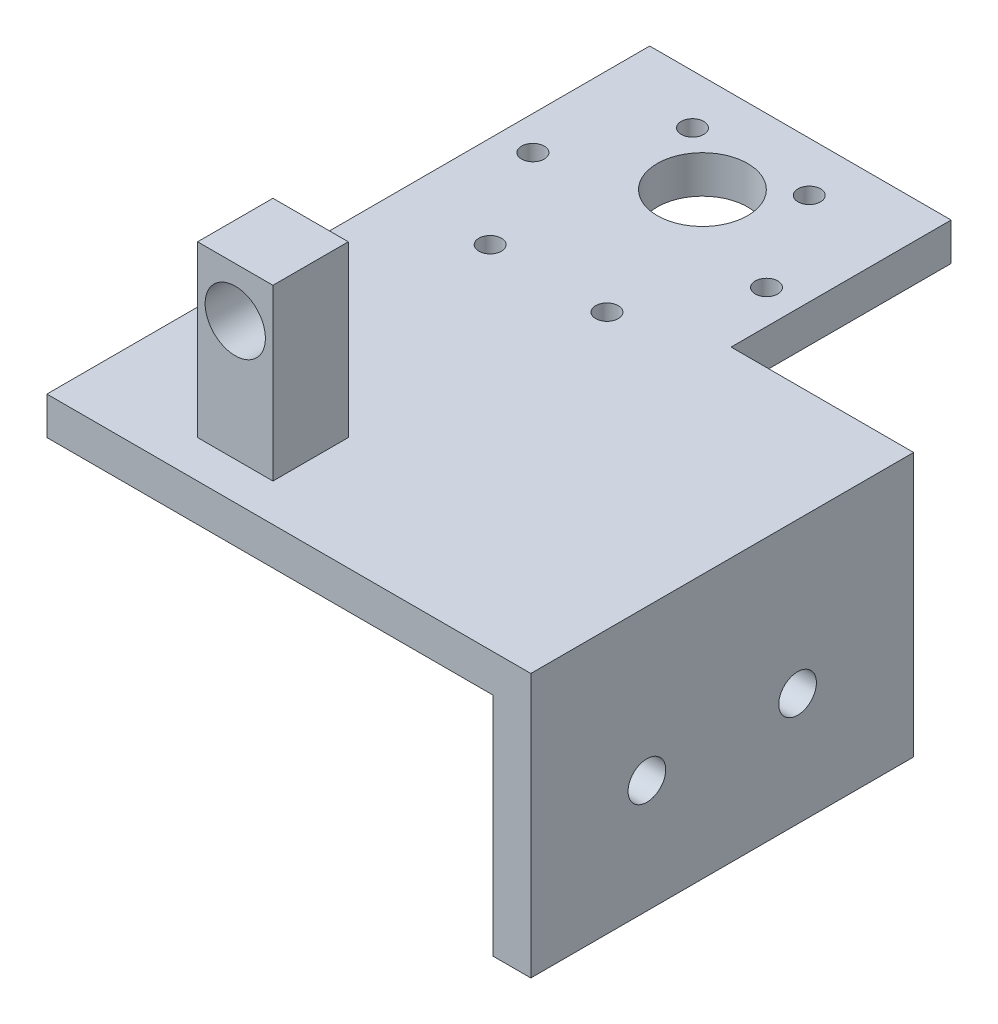
ISO-10303-21;
HEADER;
FILE_DESCRIPTION(('STEP AP214'),'2;1');
FILE_NAME('part.step','',(''),(''),'','','');
FILE_SCHEMA(('AUTOMOTIVE_DESIGN { 1 0 10303 214 1 1 1 1 }'));
ENDSEC;
DATA;
#1=APPLICATION_CONTEXT('core data for automotive mechanical design processes');
#2=APPLICATION_PROTOCOL_DEFINITION('international standard','automotive_design',2000,#1);
#3=PRODUCT_CONTEXT('',#1,'mechanical');
#4=PRODUCT('Part','Part','',(#3));
#5=PRODUCT_RELATED_PRODUCT_CATEGORY('part','',(#4));
#6=PRODUCT_DEFINITION_FORMATION('','',#4);
#7=PRODUCT_DEFINITION_CONTEXT('part definition',#1,'design');
#8=PRODUCT_DEFINITION('design','',#6,#7);
#9=PRODUCT_DEFINITION_SHAPE('','',#8);
#10=(LENGTH_UNIT() NAMED_UNIT(*) SI_UNIT(.MILLI.,.METRE.));
#11=(NAMED_UNIT(*) PLANE_ANGLE_UNIT() SI_UNIT($,.RADIAN.));
#12=(NAMED_UNIT(*) SI_UNIT($,.STERADIAN.) SOLID_ANGLE_UNIT());
#13=UNCERTAINTY_MEASURE_WITH_UNIT(LENGTH_MEASURE(1.E-05),#10,'distance_accuracy_value','');
#14=(GEOMETRIC_REPRESENTATION_CONTEXT(3) GLOBAL_UNCERTAINTY_ASSIGNED_CONTEXT((#13)) GLOBAL_UNIT_ASSIGNED_CONTEXT((#10,
#11,#12)) REPRESENTATION_CONTEXT('',''));
#15=CARTESIAN_POINT('',(0.,0.,0.));
#16=DIRECTION('',(0.,0.,1.));
#17=DIRECTION('',(1.,0.,0.));
#18=AXIS2_PLACEMENT_3D('',#15,#16,#17);
#19=CARTESIAN_POINT('',(0.,0.,0.));
#20=DIRECTION('',(0.,1.,0.));
#21=DIRECTION('',(0.,0.,1.));
#22=AXIS2_PLACEMENT_3D('',#19,#20,#21);
#23=PLANE('',#22);
#24=CARTESIAN_POINT('',(-15.5,0.,0.));
#25=DIRECTION('',(0.,1.,0.));
#26=DIRECTION('',(0.,0.,1.));
#27=AXIS2_PLACEMENT_3D('',#24,#25,#26);
#28=CIRCLE('',#27,1.5);
#29=CARTESIAN_POINT('',(-15.5,0.,1.5));
#30=VERTEX_POINT('',#29);
#31=EDGE_CURVE('E235',#30,#30,#28,.T.);
#32=ORIENTED_EDGE('',*,*,#31,.T.);
#33=EDGE_LOOP('',(#32));
#34=FACE_BOUND('',#33,.T.);
#35=CARTESIAN_POINT('',(7.75000000000006,0.,-13.4233937586588));
#36=DIRECTION('',(0.,1.,0.));
#37=DIRECTION('',(0.,0.,1.));
#38=AXIS2_PLACEMENT_3D('',#35,#36,#37);
#39=CIRCLE('',#38,1.5);
#40=CARTESIAN_POINT('',(7.75000000000006,0.,-11.9233937586588));
#41=VERTEX_POINT('',#40);
#42=EDGE_CURVE('E205',#41,#41,#39,.T.);
#43=ORIENTED_EDGE('',*,*,#42,.T.);
#44=EDGE_LOOP('',(#43));
#45=FACE_BOUND('',#44,.T.);
#46=CARTESIAN_POINT('',(-7.74999999999997,0.,-13.4233937586588));
#47=DIRECTION('',(0.,1.,0.));
#48=DIRECTION('',(0.,0.,1.));
#49=AXIS2_PLACEMENT_3D('',#46,#47,#48);
#50=CIRCLE('',#49,1.5);
#51=CARTESIAN_POINT('',(-7.74999999999997,0.,-11.9233937586588));
#52=VERTEX_POINT('',#51);
#53=EDGE_CURVE('E224',#52,#52,#50,.T.);
#54=ORIENTED_EDGE('',*,*,#53,.T.);
#55=EDGE_LOOP('',(#54));
#56=FACE_BOUND('',#55,.T.);
#57=CARTESIAN_POINT('',(0.,0.,-7.));
#58=DIRECTION('',(0.,1.,0.));
#59=DIRECTION('',(0.,0.,1.));
#60=AXIS2_PLACEMENT_3D('',#57,#58,#59);
#61=CIRCLE('',#60,6.);
#62=CARTESIAN_POINT('',(0.,0.,-0.999999999999999));
#63=VERTEX_POINT('',#62);
#64=EDGE_CURVE('E223',#63,#63,#61,.T.);
#65=ORIENTED_EDGE('',*,*,#64,.T.);
#66=EDGE_LOOP('',(#65));
#67=FACE_BOUND('',#66,.T.);
#68=CARTESIAN_POINT('',(15.5,0.,1.08235921504137E-13));
#69=DIRECTION('',(0.,1.,0.));
#70=DIRECTION('',(0.,0.,1.));
#71=AXIS2_PLACEMENT_3D('',#68,#69,#70);
#72=CIRCLE('',#71,1.5);
#73=CARTESIAN_POINT('',(15.5,0.,1.50000000000011));
#74=VERTEX_POINT('',#73);
#75=EDGE_CURVE('E206',#74,#74,#72,.T.);
#76=ORIENTED_EDGE('',*,*,#75,.T.);
#77=EDGE_LOOP('',(#76));
#78=FACE_BOUND('',#77,.T.);
#79=CARTESIAN_POINT('',(7.74999999999987,0.,13.4233937586589));
#80=DIRECTION('',(0.,1.,0.));
#81=DIRECTION('',(0.,0.,1.));
#82=AXIS2_PLACEMENT_3D('',#79,#80,#81);
#83=CIRCLE('',#82,1.5);
#84=CARTESIAN_POINT('',(7.74999999999987,0.,14.9233937586589));
#85=VERTEX_POINT('',#84);
#86=EDGE_CURVE('E212',#85,#85,#83,.T.);
#87=ORIENTED_EDGE('',*,*,#86,.T.);
#88=EDGE_LOOP('',(#87));
#89=FACE_BOUND('',#88,.T.);
#90=CARTESIAN_POINT('',(-7.75000000000016,0.,13.4233937586587));
#91=DIRECTION('',(0.,1.,0.));
#92=DIRECTION('',(0.,0.,1.));
#93=AXIS2_PLACEMENT_3D('',#90,#91,#92);
#94=CIRCLE('',#93,1.5);
#95=CARTESIAN_POINT('',(-7.75000000000016,0.,14.9233937586587));
#96=VERTEX_POINT('',#95);
#97=EDGE_CURVE('E201',#96,#96,#94,.T.);
#98=ORIENTED_EDGE('',*,*,#97,.T.);
#99=EDGE_LOOP('',(#98));
#100=FACE_BOUND('',#99,.T.);
#101=DIRECTION('',(0.,0.,-1.));
#102=VECTOR('',#101,1.);
#103=CARTESIAN_POINT('',(39.225,0.,60.));
#104=LINE('',#103,#102);
#105=CARTESIAN_POINT('',(39.225,0.,60.));
#106=VERTEX_POINT('',#105);
#107=CARTESIAN_POINT('',(39.225,0.,9.2));
#108=VERTEX_POINT('',#107);
#109=EDGE_CURVE('E48',#106,#108,#104,.T.);
#110=ORIENTED_EDGE('',*,*,#109,.F.);
#111=DIRECTION('',(1.,0.,0.));
#112=VECTOR('',#111,1.);
#113=CARTESIAN_POINT('',(-20.,0.,60.));
#114=LINE('',#113,#112);
#115=CARTESIAN_POINT('',(-20.,0.,60.));
#116=VERTEX_POINT('',#115);
#117=EDGE_CURVE('E257',#116,#106,#114,.T.);
#118=ORIENTED_EDGE('',*,*,#117,.F.);
#119=DIRECTION('',(0.,0.,1.));
#120=VECTOR('',#119,1.);
#121=CARTESIAN_POINT('',(-20.,0.,-20.));
#122=LINE('',#121,#120);
#123=CARTESIAN_POINT('',(-20.,0.,-20.));
#124=VERTEX_POINT('',#123);
#125=EDGE_CURVE('E241',#124,#116,#122,.T.);
#126=ORIENTED_EDGE('',*,*,#125,.F.);
#127=DIRECTION('',(-1.,0.,0.));
#128=VECTOR('',#127,1.);
#129=CARTESIAN_POINT('',(-20.,0.,-20.));
#130=LINE('',#129,#128);
#131=CARTESIAN_POINT('',(20.,0.,-20.));
#132=VERTEX_POINT('',#131);
#133=EDGE_CURVE('E248',#132,#124,#130,.T.);
#134=ORIENTED_EDGE('',*,*,#133,.F.);
#135=DIRECTION('',(0.,0.,-1.));
#136=VECTOR('',#135,1.);
#137=CARTESIAN_POINT('',(20.,0.,-20.));
#138=LINE('',#137,#136);
#139=CARTESIAN_POINT('',(20.,0.,9.2));
#140=VERTEX_POINT('',#139);
#141=EDGE_CURVE('E259',#140,#132,#138,.T.);
#142=ORIENTED_EDGE('',*,*,#141,.F.);
#143=DIRECTION('',(-1.,0.,0.));
#144=VECTOR('',#143,1.);
#145=CARTESIAN_POINT('',(44.225,0.,9.2));
#146=LINE('',#145,#144);
#147=EDGE_CURVE('E55',#108,#140,#146,.T.);
#148=ORIENTED_EDGE('',*,*,#147,.F.);
#149=EDGE_LOOP('',(#110,#118,#126,#134,#142,#148));
#150=FACE_BOUND('',#149,.T.);
#151=ADVANCED_FACE('F33',(#34,#45,#56,#67,#78,#89,#100,#150),#23,.F.);
#152=CARTESIAN_POINT('',(20.,5.,-20.));
#153=DIRECTION('',(-1.,0.,0.));
#154=DIRECTION('',(0.,0.,1.));
#155=AXIS2_PLACEMENT_3D('',#152,#153,#154);
#156=PLANE('',#155);
#157=DIRECTION('',(0.,1.,0.));
#158=VECTOR('',#157,1.);
#159=CARTESIAN_POINT('',(20.,5.,9.2));
#160=LINE('',#159,#158);
#161=CARTESIAN_POINT('',(20.,5.,9.2));
#162=VERTEX_POINT('',#161);
#163=EDGE_CURVE('E133',#140,#162,#160,.T.);
#164=ORIENTED_EDGE('',*,*,#163,.F.);
#165=ORIENTED_EDGE('',*,*,#141,.T.);
#166=DIRECTION('',(0.,-1.,0.));
#167=VECTOR('',#166,1.);
#168=CARTESIAN_POINT('',(20.,5.,-20.));
#169=LINE('',#168,#167);
#170=CARTESIAN_POINT('',(20.,5.,-20.));
#171=VERTEX_POINT('',#170);
#172=EDGE_CURVE('E41',#171,#132,#169,.T.);
#173=ORIENTED_EDGE('',*,*,#172,.F.);
#174=DIRECTION('',(0.,0.,-1.));
#175=VECTOR('',#174,1.);
#176=CARTESIAN_POINT('',(20.,5.,-20.));
#177=LINE('',#176,#175);
#178=EDGE_CURVE('E250',#162,#171,#177,.T.);
#179=ORIENTED_EDGE('',*,*,#178,.F.);
#180=EDGE_LOOP('',(#164,#165,#173,#179));
#181=FACE_BOUND('',#180,.T.);
#182=ADVANCED_FACE('F280',(#181),#156,.F.);
#183=CARTESIAN_POINT('',(0.,5.,0.));
#184=DIRECTION('',(0.,1.,0.));
#185=DIRECTION('',(0.,0.,1.));
#186=AXIS2_PLACEMENT_3D('',#183,#184,#185);
#187=PLANE('',#186);
#188=CARTESIAN_POINT('',(-7.75000000000016,5.,13.4233937586587));
#189=DIRECTION('',(0.,1.,0.));
#190=DIRECTION('',(0.,0.,1.));
#191=AXIS2_PLACEMENT_3D('',#188,#189,#190);
#192=CIRCLE('',#191,1.5);
#193=CARTESIAN_POINT('',(-7.75000000000016,5.,14.9233937586587));
#194=VERTEX_POINT('',#193);
#195=EDGE_CURVE('E215',#194,#194,#192,.T.);
#196=ORIENTED_EDGE('',*,*,#195,.F.);
#197=EDGE_LOOP('',(#196));
#198=FACE_BOUND('',#197,.T.);
#199=CARTESIAN_POINT('',(7.74999999999987,5.,13.4233937586589));
#200=DIRECTION('',(0.,1.,0.));
#201=DIRECTION('',(0.,0.,1.));
#202=AXIS2_PLACEMENT_3D('',#199,#200,#201);
#203=CIRCLE('',#202,1.5);
#204=CARTESIAN_POINT('',(7.74999999999987,5.,14.9233937586589));
#205=VERTEX_POINT('',#204);
#206=EDGE_CURVE('E209',#205,#205,#203,.T.);
#207=ORIENTED_EDGE('',*,*,#206,.F.);
#208=EDGE_LOOP('',(#207));
#209=FACE_BOUND('',#208,.T.);
#210=CARTESIAN_POINT('',(15.5,5.,1.08235921504137E-13));
#211=DIRECTION('',(0.,1.,0.));
#212=DIRECTION('',(0.,0.,1.));
#213=AXIS2_PLACEMENT_3D('',#210,#211,#212);
#214=CIRCLE('',#213,1.5);
#215=CARTESIAN_POINT('',(15.5,5.,1.50000000000011));
#216=VERTEX_POINT('',#215);
#217=EDGE_CURVE('E202',#216,#216,#214,.T.);
#218=ORIENTED_EDGE('',*,*,#217,.F.);
#219=EDGE_LOOP('',(#218));
#220=FACE_BOUND('',#219,.T.);
#221=CARTESIAN_POINT('',(0.,5.,-7.));
#222=DIRECTION('',(0.,1.,0.));
#223=DIRECTION('',(0.,0.,1.));
#224=AXIS2_PLACEMENT_3D('',#221,#222,#223);
#225=CIRCLE('',#224,6.);
#226=CARTESIAN_POINT('',(0.,5.,-0.999999999999999));
#227=VERTEX_POINT('',#226);
#228=EDGE_CURVE('E232',#227,#227,#225,.T.);
#229=ORIENTED_EDGE('',*,*,#228,.F.);
#230=EDGE_LOOP('',(#229));
#231=FACE_BOUND('',#230,.T.);
#232=CARTESIAN_POINT('',(-7.74999999999997,5.,-13.4233937586588));
#233=DIRECTION('',(0.,1.,0.));
#234=DIRECTION('',(0.,0.,1.));
#235=AXIS2_PLACEMENT_3D('',#232,#233,#234);
#236=CIRCLE('',#235,1.5);
#237=CARTESIAN_POINT('',(-7.74999999999997,5.,-11.9233937586588));
#238=VERTEX_POINT('',#237);
#239=EDGE_CURVE('E220',#238,#238,#236,.T.);
#240=ORIENTED_EDGE('',*,*,#239,.F.);
#241=EDGE_LOOP('',(#240));
#242=FACE_BOUND('',#241,.T.);
#243=CARTESIAN_POINT('',(7.75000000000006,5.,-13.4233937586588));
#244=DIRECTION('',(0.,1.,0.));
#245=DIRECTION('',(0.,0.,1.));
#246=AXIS2_PLACEMENT_3D('',#243,#244,#245);
#247=CIRCLE('',#246,1.5);
#248=CARTESIAN_POINT('',(7.75000000000006,5.,-11.9233937586588));
#249=VERTEX_POINT('',#248);
#250=EDGE_CURVE('E227',#249,#249,#247,.T.);
#251=ORIENTED_EDGE('',*,*,#250,.F.);
#252=EDGE_LOOP('',(#251));
#253=FACE_BOUND('',#252,.T.);
#254=CARTESIAN_POINT('',(-15.5,5.,0.));
#255=DIRECTION('',(0.,1.,0.));
#256=DIRECTION('',(0.,0.,1.));
#257=AXIS2_PLACEMENT_3D('',#254,#255,#256);
#258=CIRCLE('',#257,1.5);
#259=CARTESIAN_POINT('',(-15.5,5.,1.5));
#260=VERTEX_POINT('',#259);
#261=EDGE_CURVE('E238',#260,#260,#258,.T.);
#262=ORIENTED_EDGE('',*,*,#261,.F.);
#263=EDGE_LOOP('',(#262));
#264=FACE_BOUND('',#263,.T.);
#265=DIRECTION('',(0.,0.,1.));
#266=VECTOR('',#265,1.);
#267=CARTESIAN_POINT('',(-20.,5.,-20.));
#268=LINE('',#267,#266);
#269=CARTESIAN_POINT('',(-20.,5.,-20.));
#270=VERTEX_POINT('',#269);
#271=CARTESIAN_POINT('',(-20.,5.,60.));
#272=VERTEX_POINT('',#271);
#273=EDGE_CURVE('E244',#270,#272,#268,.T.);
#274=ORIENTED_EDGE('',*,*,#273,.T.);
#275=DIRECTION('',(1.,0.,0.));
#276=VECTOR('',#275,1.);
#277=CARTESIAN_POINT('',(-20.,5.,60.));
#278=LINE('',#277,#276);
#279=CARTESIAN_POINT('',(44.225,5.,60.));
#280=VERTEX_POINT('',#279);
#281=EDGE_CURVE('E247',#272,#280,#278,.T.);
#282=ORIENTED_EDGE('',*,*,#281,.T.);
#283=DIRECTION('',(0.,0.,1.));
#284=VECTOR('',#283,1.);
#285=CARTESIAN_POINT('',(44.225,5.,60.));
#286=LINE('',#285,#284);
#287=CARTESIAN_POINT('',(44.225,5.,9.2));
#288=VERTEX_POINT('',#287);
#289=EDGE_CURVE('E130',#288,#280,#286,.T.);
#290=ORIENTED_EDGE('',*,*,#289,.F.);
#291=DIRECTION('',(-1.,0.,0.));
#292=VECTOR('',#291,1.);
#293=CARTESIAN_POINT('',(44.225,5.,9.2));
#294=LINE('',#293,#292);
#295=EDGE_CURVE('E161',#288,#162,#294,.T.);
#296=ORIENTED_EDGE('',*,*,#295,.T.);
#297=ORIENTED_EDGE('',*,*,#178,.T.);
#298=DIRECTION('',(-1.,0.,0.));
#299=VECTOR('',#298,1.);
#300=CARTESIAN_POINT('',(-20.,5.,-20.));
#301=LINE('',#300,#299);
#302=EDGE_CURVE('E252',#171,#270,#301,.T.);
#303=ORIENTED_EDGE('',*,*,#302,.T.);
#304=EDGE_LOOP('',(#274,#282,#290,#296,#297,#303));
#305=FACE_BOUND('',#304,.T.);
#306=DIRECTION('',(-1.,0.,0.));
#307=VECTOR('',#306,1.);
#308=CARTESIAN_POINT('',(5.00000000000001,5.,45.));
#309=LINE('',#308,#307);
#310=CARTESIAN_POINT('',(5.00000000000001,5.,45.));
#311=VERTEX_POINT('',#310);
#312=CARTESIAN_POINT('',(-4.99999999999999,5.,45.));
#313=VERTEX_POINT('',#312);
#314=EDGE_CURVE('E186',#311,#313,#309,.T.);
#315=ORIENTED_EDGE('',*,*,#314,.F.);
#316=DIRECTION('',(0.,0.,-1.));
#317=VECTOR('',#316,1.);
#318=CARTESIAN_POINT('',(5.00000000000001,5.,45.));
#319=LINE('',#318,#317);
#320=CARTESIAN_POINT('',(5.00000000000001,5.,55.));
#321=VERTEX_POINT('',#320);
#322=EDGE_CURVE('E170',#321,#311,#319,.T.);
#323=ORIENTED_EDGE('',*,*,#322,.F.);
#324=DIRECTION('',(1.,0.,0.));
#325=VECTOR('',#324,1.);
#326=CARTESIAN_POINT('',(5.00000000000001,5.,55.));
#327=LINE('',#326,#325);
#328=CARTESIAN_POINT('',(-4.99999999999999,5.,55.));
#329=VERTEX_POINT('',#328);
#330=EDGE_CURVE('E177',#329,#321,#327,.T.);
#331=ORIENTED_EDGE('',*,*,#330,.F.);
#332=DIRECTION('',(0.,0.,1.));
#333=VECTOR('',#332,1.);
#334=CARTESIAN_POINT('',(-4.99999999999999,5.,45.));
#335=LINE('',#334,#333);
#336=EDGE_CURVE('E188',#313,#329,#335,.T.);
#337=ORIENTED_EDGE('',*,*,#336,.F.);
#338=EDGE_LOOP('',(#315,#323,#331,#337));
#339=FACE_BOUND('',#338,.T.);
#340=ADVANCED_FACE('F277',(#198,#209,#220,#231,#242,#253,#264,#305,#339),#187,.T.);
#341=CARTESIAN_POINT('',(-20.,5.,-20.));
#342=DIRECTION('',(1.,0.,0.));
#343=DIRECTION('',(0.,0.,-1.));
#344=AXIS2_PLACEMENT_3D('',#341,#342,#343);
#345=PLANE('',#344);
#346=ORIENTED_EDGE('',*,*,#125,.T.);
#347=DIRECTION('',(0.,-1.,0.));
#348=VECTOR('',#347,1.);
#349=CARTESIAN_POINT('',(-20.,5.,60.));
#350=LINE('',#349,#348);
#351=EDGE_CURVE('E11',#272,#116,#350,.T.);
#352=ORIENTED_EDGE('',*,*,#351,.F.);
#353=ORIENTED_EDGE('',*,*,#273,.F.);
#354=DIRECTION('',(0.,-1.,0.));
#355=VECTOR('',#354,1.);
#356=CARTESIAN_POINT('',(-20.,5.,-20.));
#357=LINE('',#356,#355);
#358=EDGE_CURVE('E254',#270,#124,#357,.T.);
#359=ORIENTED_EDGE('',*,*,#358,.T.);
#360=EDGE_LOOP('',(#346,#352,#353,#359));
#361=FACE_BOUND('',#360,.T.);
#362=ADVANCED_FACE('F35',(#361),#345,.F.);
#363=CARTESIAN_POINT('',(-20.,5.,60.));
#364=DIRECTION('',(0.,0.,-1.));
#365=DIRECTION('',(-1.,0.,0.));
#366=AXIS2_PLACEMENT_3D('',#363,#364,#365);
#367=PLANE('',#366);
#368=ORIENTED_EDGE('',*,*,#117,.T.);
#369=DIRECTION('',(0.,1.,0.));
#370=VECTOR('',#369,1.);
#371=CARTESIAN_POINT('',(39.225,-30.,60.));
#372=LINE('',#371,#370);
#373=CARTESIAN_POINT('',(39.225,-30.,60.));
#374=VERTEX_POINT('',#373);
#375=EDGE_CURVE('E139',#374,#106,#372,.T.);
#376=ORIENTED_EDGE('',*,*,#375,.F.);
#377=DIRECTION('',(-1.,0.,0.));
#378=VECTOR('',#377,1.);
#379=CARTESIAN_POINT('',(44.225,-30.,60.));
#380=LINE('',#379,#378);
#381=CARTESIAN_POINT('',(44.225,-30.,60.));
#382=VERTEX_POINT('',#381);
#383=EDGE_CURVE('E136',#382,#374,#380,.T.);
#384=ORIENTED_EDGE('',*,*,#383,.F.);
#385=DIRECTION('',(0.,-1.,0.));
#386=VECTOR('',#385,1.);
#387=CARTESIAN_POINT('',(44.225,5.,60.));
#388=LINE('',#387,#386);
#389=EDGE_CURVE('E124',#280,#382,#388,.T.);
#390=ORIENTED_EDGE('',*,*,#389,.F.);
#391=ORIENTED_EDGE('',*,*,#281,.F.);
#392=ORIENTED_EDGE('',*,*,#351,.T.);
#393=EDGE_LOOP('',(#368,#376,#384,#390,#391,#392));
#394=FACE_BOUND('',#393,.T.);
#395=ADVANCED_FACE('F137',(#394),#367,.F.);
#396=CARTESIAN_POINT('',(-20.,5.,-20.));
#397=DIRECTION('',(0.,0.,1.));
#398=DIRECTION('',(1.,0.,0.));
#399=AXIS2_PLACEMENT_3D('',#396,#397,#398);
#400=PLANE('',#399);
#401=ORIENTED_EDGE('',*,*,#133,.T.);
#402=ORIENTED_EDGE('',*,*,#358,.F.);
#403=ORIENTED_EDGE('',*,*,#302,.F.);
#404=ORIENTED_EDGE('',*,*,#172,.T.);
#405=EDGE_LOOP('',(#401,#402,#403,#404));
#406=FACE_BOUND('',#405,.T.);
#407=ADVANCED_FACE('F268',(#406),#400,.F.);
#408=CARTESIAN_POINT('',(-15.5,5.,0.));
#409=DIRECTION('',(0.,-1.,0.));
#410=DIRECTION('',(0.,0.,-1.));
#411=AXIS2_PLACEMENT_3D('',#408,#409,#410);
#412=CYLINDRICAL_SURFACE('',#411,1.5);
#413=ORIENTED_EDGE('',*,*,#261,.T.);
#414=EDGE_LOOP('',(#413));
#415=FACE_BOUND('',#414,.T.);
#416=ORIENTED_EDGE('',*,*,#31,.F.);
#417=EDGE_LOOP('',(#416));
#418=FACE_BOUND('',#417,.T.);
#419=ADVANCED_FACE('F310',(#415,#418),#412,.F.);
#420=CARTESIAN_POINT('',(7.75000000000006,5.,-13.4233937586588));
#421=DIRECTION('',(0.,-1.,0.));
#422=DIRECTION('',(0.,0.,-1.));
#423=AXIS2_PLACEMENT_3D('',#420,#421,#422);
#424=CYLINDRICAL_SURFACE('',#423,1.5);
#425=ORIENTED_EDGE('',*,*,#250,.T.);
#426=EDGE_LOOP('',(#425));
#427=FACE_BOUND('',#426,.T.);
#428=ORIENTED_EDGE('',*,*,#42,.F.);
#429=EDGE_LOOP('',(#428));
#430=FACE_BOUND('',#429,.T.);
#431=ADVANCED_FACE('F337',(#427,#430),#424,.F.);
#432=CARTESIAN_POINT('',(-7.74999999999997,5.,-13.4233937586588));
#433=DIRECTION('',(0.,-1.,0.));
#434=DIRECTION('',(0.,0.,-1.));
#435=AXIS2_PLACEMENT_3D('',#432,#433,#434);
#436=CYLINDRICAL_SURFACE('',#435,1.5);
#437=ORIENTED_EDGE('',*,*,#239,.T.);
#438=EDGE_LOOP('',(#437));
#439=FACE_BOUND('',#438,.T.);
#440=ORIENTED_EDGE('',*,*,#53,.F.);
#441=EDGE_LOOP('',(#440));
#442=FACE_BOUND('',#441,.T.);
#443=ADVANCED_FACE('F342',(#439,#442),#436,.F.);
#444=CARTESIAN_POINT('',(0.,5.,-7.));
#445=DIRECTION('',(0.,-1.,0.));
#446=DIRECTION('',(0.,0.,-1.));
#447=AXIS2_PLACEMENT_3D('',#444,#445,#446);
#448=CYLINDRICAL_SURFACE('',#447,6.);
#449=ORIENTED_EDGE('',*,*,#228,.T.);
#450=EDGE_LOOP('',(#449));
#451=FACE_BOUND('',#450,.T.);
#452=ORIENTED_EDGE('',*,*,#64,.F.);
#453=EDGE_LOOP('',(#452));
#454=FACE_BOUND('',#453,.T.);
#455=ADVANCED_FACE('F346',(#451,#454),#448,.F.);
#456=CARTESIAN_POINT('',(15.5,5.,1.08235921504137E-13));
#457=DIRECTION('',(0.,-1.,0.));
#458=DIRECTION('',(0.,0.,-1.));
#459=AXIS2_PLACEMENT_3D('',#456,#457,#458);
#460=CYLINDRICAL_SURFACE('',#459,1.5);
#461=ORIENTED_EDGE('',*,*,#217,.T.);
#462=EDGE_LOOP('',(#461));
#463=FACE_BOUND('',#462,.T.);
#464=ORIENTED_EDGE('',*,*,#75,.F.);
#465=EDGE_LOOP('',(#464));
#466=FACE_BOUND('',#465,.T.);
#467=ADVANCED_FACE('F348',(#463,#466),#460,.F.);
#468=CARTESIAN_POINT('',(7.74999999999987,5.,13.4233937586589));
#469=DIRECTION('',(0.,-1.,0.));
#470=DIRECTION('',(0.,0.,-1.));
#471=AXIS2_PLACEMENT_3D('',#468,#469,#470);
#472=CYLINDRICAL_SURFACE('',#471,1.5);
#473=ORIENTED_EDGE('',*,*,#206,.T.);
#474=EDGE_LOOP('',(#473));
#475=FACE_BOUND('',#474,.T.);
#476=ORIENTED_EDGE('',*,*,#86,.F.);
#477=EDGE_LOOP('',(#476));
#478=FACE_BOUND('',#477,.T.);
#479=ADVANCED_FACE('F358',(#475,#478),#472,.F.);
#480=CARTESIAN_POINT('',(-7.75000000000016,5.,13.4233937586587));
#481=DIRECTION('',(0.,-1.,0.));
#482=DIRECTION('',(0.,0.,-1.));
#483=AXIS2_PLACEMENT_3D('',#480,#481,#482);
#484=CYLINDRICAL_SURFACE('',#483,1.5);
#485=ORIENTED_EDGE('',*,*,#195,.T.);
#486=EDGE_LOOP('',(#485));
#487=FACE_BOUND('',#486,.T.);
#488=ORIENTED_EDGE('',*,*,#97,.F.);
#489=EDGE_LOOP('',(#488));
#490=FACE_BOUND('',#489,.T.);
#491=ADVANCED_FACE('F354',(#487,#490),#484,.F.);
#492=CARTESIAN_POINT('',(5.00000000000001,27.5,45.));
#493=DIRECTION('',(-1.,0.,0.));
#494=DIRECTION('',(0.,0.,1.));
#495=AXIS2_PLACEMENT_3D('',#492,#493,#494);
#496=PLANE('',#495);
#497=ORIENTED_EDGE('',*,*,#322,.T.);
#498=DIRECTION('',(0.,-1.,0.));
#499=VECTOR('',#498,1.);
#500=CARTESIAN_POINT('',(5.00000000000001,27.5,45.));
#501=LINE('',#500,#499);
#502=CARTESIAN_POINT('',(5.00000000000001,27.5,45.));
#503=VERTEX_POINT('',#502);
#504=EDGE_CURVE('E199',#503,#311,#501,.T.);
#505=ORIENTED_EDGE('',*,*,#504,.F.);
#506=DIRECTION('',(0.,0.,-1.));
#507=VECTOR('',#506,1.);
#508=CARTESIAN_POINT('',(5.00000000000001,27.5,45.));
#509=LINE('',#508,#507);
#510=CARTESIAN_POINT('',(5.00000000000001,27.5,55.));
#511=VERTEX_POINT('',#510);
#512=EDGE_CURVE('E173',#511,#503,#509,.T.);
#513=ORIENTED_EDGE('',*,*,#512,.F.);
#514=DIRECTION('',(0.,-1.,0.));
#515=VECTOR('',#514,1.);
#516=CARTESIAN_POINT('',(5.00000000000001,27.5,55.));
#517=LINE('',#516,#515);
#518=EDGE_CURVE('E183',#511,#321,#517,.T.);
#519=ORIENTED_EDGE('',*,*,#518,.T.);
#520=EDGE_LOOP('',(#497,#505,#513,#519));
#521=FACE_BOUND('',#520,.T.);
#522=ADVANCED_FACE('F357',(#521),#496,.F.);
#523=CARTESIAN_POINT('',(5.00000000000001,27.5,45.));
#524=DIRECTION('',(0.,0.,1.));
#525=DIRECTION('',(1.,0.,0.));
#526=AXIS2_PLACEMENT_3D('',#523,#524,#525);
#527=PLANE('',#526);
#528=ORIENTED_EDGE('',*,*,#314,.T.);
#529=DIRECTION('',(0.,-1.,0.));
#530=VECTOR('',#529,1.);
#531=CARTESIAN_POINT('',(-4.99999999999999,27.5,45.));
#532=LINE('',#531,#530);
#533=CARTESIAN_POINT('',(-4.99999999999999,27.5,45.));
#534=VERTEX_POINT('',#533);
#535=EDGE_CURVE('E196',#534,#313,#532,.T.);
#536=ORIENTED_EDGE('',*,*,#535,.F.);
#537=DIRECTION('',(-1.,0.,0.));
#538=VECTOR('',#537,1.);
#539=CARTESIAN_POINT('',(5.00000000000001,27.5,45.));
#540=LINE('',#539,#538);
#541=EDGE_CURVE('E176',#503,#534,#540,.T.);
#542=ORIENTED_EDGE('',*,*,#541,.F.);
#543=ORIENTED_EDGE('',*,*,#504,.T.);
#544=EDGE_LOOP('',(#528,#536,#542,#543));
#545=FACE_BOUND('',#544,.T.);
#546=ADVANCED_FACE('F368',(#545),#527,.F.);
#547=CARTESIAN_POINT('',(-4.99999999999999,27.5,45.));
#548=DIRECTION('',(1.,0.,0.));
#549=DIRECTION('',(0.,0.,-1.));
#550=AXIS2_PLACEMENT_3D('',#547,#548,#549);
#551=PLANE('',#550);
#552=ORIENTED_EDGE('',*,*,#336,.T.);
#553=DIRECTION('',(0.,-1.,0.));
#554=VECTOR('',#553,1.);
#555=CARTESIAN_POINT('',(-4.99999999999999,27.5,55.));
#556=LINE('',#555,#554);
#557=CARTESIAN_POINT('',(-4.99999999999999,27.5,55.));
#558=VERTEX_POINT('',#557);
#559=EDGE_CURVE('E194',#558,#329,#556,.T.);
#560=ORIENTED_EDGE('',*,*,#559,.F.);
#561=DIRECTION('',(0.,0.,1.));
#562=VECTOR('',#561,1.);
#563=CARTESIAN_POINT('',(-4.99999999999999,27.5,45.));
#564=LINE('',#563,#562);
#565=EDGE_CURVE('E179',#534,#558,#564,.T.);
#566=ORIENTED_EDGE('',*,*,#565,.F.);
#567=ORIENTED_EDGE('',*,*,#535,.T.);
#568=EDGE_LOOP('',(#552,#560,#566,#567));
#569=FACE_BOUND('',#568,.T.);
#570=ADVANCED_FACE('F372',(#569),#551,.F.);
#571=CARTESIAN_POINT('',(5.00000000000001,27.5,55.));
#572=DIRECTION('',(0.,0.,-1.));
#573=DIRECTION('',(-1.,0.,0.));
#574=AXIS2_PLACEMENT_3D('',#571,#572,#573);
#575=PLANE('',#574);
#576=CARTESIAN_POINT('',(0.,20.9,55.));
#577=DIRECTION('',(0.,0.,1.));
#578=DIRECTION('',(1.,0.,0.));
#579=AXIS2_PLACEMENT_3D('',#576,#577,#578);
#580=CIRCLE('',#579,4.);
#581=CARTESIAN_POINT('',(4.,20.9,55.));
#582=VERTEX_POINT('',#581);
#583=EDGE_CURVE('E166',#582,#582,#580,.T.);
#584=ORIENTED_EDGE('',*,*,#583,.F.);
#585=EDGE_LOOP('',(#584));
#586=FACE_BOUND('',#585,.T.);
#587=ORIENTED_EDGE('',*,*,#330,.T.);
#588=ORIENTED_EDGE('',*,*,#518,.F.);
#589=DIRECTION('',(1.,0.,0.));
#590=VECTOR('',#589,1.);
#591=CARTESIAN_POINT('',(5.00000000000001,27.5,55.));
#592=LINE('',#591,#590);
#593=EDGE_CURVE('E181',#558,#511,#592,.T.);
#594=ORIENTED_EDGE('',*,*,#593,.F.);
#595=ORIENTED_EDGE('',*,*,#559,.T.);
#596=EDGE_LOOP('',(#587,#588,#594,#595));
#597=FACE_BOUND('',#596,.T.);
#598=ADVANCED_FACE('F376',(#586,#597),#575,.F.);
#599=CARTESIAN_POINT('',(0.,27.5,0.));
#600=DIRECTION('',(0.,-1.,0.));
#601=DIRECTION('',(0.,0.,-1.));
#602=AXIS2_PLACEMENT_3D('',#599,#600,#601);
#603=PLANE('',#602);
#604=ORIENTED_EDGE('',*,*,#512,.T.);
#605=ORIENTED_EDGE('',*,*,#541,.T.);
#606=ORIENTED_EDGE('',*,*,#565,.T.);
#607=ORIENTED_EDGE('',*,*,#593,.T.);
#608=EDGE_LOOP('',(#604,#605,#606,#607));
#609=FACE_BOUND('',#608,.T.);
#610=ADVANCED_FACE('F380',(#609),#603,.F.);
#611=CARTESIAN_POINT('',(0.,20.9,47.));
#612=DIRECTION('',(0.,0.,1.));
#613=DIRECTION('',(1.,0.,0.));
#614=AXIS2_PLACEMENT_3D('',#611,#612,#613);
#615=CYLINDRICAL_SURFACE('',#614,4.);
#616=CARTESIAN_POINT('',(0.,20.9,47.));
#617=DIRECTION('',(0.,0.,1.));
#618=DIRECTION('',(1.,0.,0.));
#619=AXIS2_PLACEMENT_3D('',#616,#617,#618);
#620=CIRCLE('',#619,4.);
#621=CARTESIAN_POINT('',(4.,20.9,47.));
#622=VERTEX_POINT('',#621);
#623=EDGE_CURVE('E167',#622,#622,#620,.T.);
#624=ORIENTED_EDGE('',*,*,#623,.F.);
#625=EDGE_LOOP('',(#624));
#626=FACE_BOUND('',#625,.T.);
#627=ORIENTED_EDGE('',*,*,#583,.T.);
#628=EDGE_LOOP('',(#627));
#629=FACE_BOUND('',#628,.T.);
#630=ADVANCED_FACE('F384',(#626,#629),#615,.F.);
#631=CARTESIAN_POINT('',(0.,20.9,47.));
#632=DIRECTION('',(0.,0.,1.));
#633=DIRECTION('',(1.,0.,0.));
#634=AXIS2_PLACEMENT_3D('',#631,#632,#633);
#635=PLANE('',#634);
#636=ORIENTED_EDGE('',*,*,#623,.T.);
#637=EDGE_LOOP('',(#636));
#638=FACE_BOUND('',#637,.T.);
#639=ADVANCED_FACE('F388',(#638),#635,.T.);
#640=CARTESIAN_POINT('',(44.225,5.,9.2));
#641=DIRECTION('',(0.,0.,1.));
#642=DIRECTION('',(1.,0.,0.));
#643=AXIS2_PLACEMENT_3D('',#640,#641,#642);
#644=PLANE('',#643);
#645=ORIENTED_EDGE('',*,*,#163,.T.);
#646=ORIENTED_EDGE('',*,*,#295,.F.);
#647=DIRECTION('',(0.,1.,0.));
#648=VECTOR('',#647,1.);
#649=CARTESIAN_POINT('',(44.225,5.,9.2));
#650=LINE('',#649,#648);
#651=CARTESIAN_POINT('',(44.225,-30.,9.2));
#652=VERTEX_POINT('',#651);
#653=EDGE_CURVE('E132',#652,#288,#650,.T.);
#654=ORIENTED_EDGE('',*,*,#653,.F.);
#655=DIRECTION('',(1.,0.,0.));
#656=VECTOR('',#655,1.);
#657=CARTESIAN_POINT('',(44.225,-30.,9.2));
#658=LINE('',#657,#656);
#659=CARTESIAN_POINT('',(39.225,-30.,9.2));
#660=VERTEX_POINT('',#659);
#661=EDGE_CURVE('E147',#660,#652,#658,.T.);
#662=ORIENTED_EDGE('',*,*,#661,.F.);
#663=DIRECTION('',(0.,1.,0.));
#664=VECTOR('',#663,1.);
#665=CARTESIAN_POINT('',(39.225,-30.,9.2));
#666=LINE('',#665,#664);
#667=EDGE_CURVE('E155',#660,#108,#666,.T.);
#668=ORIENTED_EDGE('',*,*,#667,.T.);
#669=ORIENTED_EDGE('',*,*,#147,.T.);
#670=EDGE_LOOP('',(#645,#646,#654,#662,#668,#669));
#671=FACE_BOUND('',#670,.T.);
#672=ADVANCED_FACE('F281',(#671),#644,.F.);
#673=CARTESIAN_POINT('',(44.225,0.,0.));
#674=DIRECTION('',(1.,0.,0.));
#675=DIRECTION('',(0.,0.,-1.));
#676=AXIS2_PLACEMENT_3D('',#673,#674,#675);
#677=PLANE('',#676);
#678=CARTESIAN_POINT('',(44.225,-15.,24.6));
#679=DIRECTION('',(1.,0.,0.));
#680=DIRECTION('',(0.,0.,-1.));
#681=AXIS2_PLACEMENT_3D('',#678,#679,#680);
#682=CIRCLE('',#681,2.5);
#683=CARTESIAN_POINT('',(44.225,-15.,22.1));
#684=VERTEX_POINT('',#683);
#685=EDGE_CURVE('E438',#684,#684,#682,.T.);
#686=ORIENTED_EDGE('',*,*,#685,.F.);
#687=EDGE_LOOP('',(#686));
#688=FACE_BOUND('',#687,.T.);
#689=CARTESIAN_POINT('',(44.225,-15.,44.6));
#690=DIRECTION('',(1.,0.,0.));
#691=DIRECTION('',(0.,0.,-1.));
#692=AXIS2_PLACEMENT_3D('',#689,#690,#691);
#693=CIRCLE('',#692,2.5);
#694=CARTESIAN_POINT('',(44.225,-15.,42.1));
#695=VERTEX_POINT('',#694);
#696=EDGE_CURVE('E440',#695,#695,#693,.T.);
#697=ORIENTED_EDGE('',*,*,#696,.F.);
#698=EDGE_LOOP('',(#697));
#699=FACE_BOUND('',#698,.T.);
#700=ORIENTED_EDGE('',*,*,#389,.T.);
#701=DIRECTION('',(0.,0.,1.));
#702=VECTOR('',#701,1.);
#703=CARTESIAN_POINT('',(44.225,-30.,60.));
#704=LINE('',#703,#702);
#705=EDGE_CURVE('E128',#652,#382,#704,.T.);
#706=ORIENTED_EDGE('',*,*,#705,.F.);
#707=ORIENTED_EDGE('',*,*,#653,.T.);
#708=ORIENTED_EDGE('',*,*,#289,.T.);
#709=EDGE_LOOP('',(#700,#706,#707,#708));
#710=FACE_BOUND('',#709,.T.);
#711=ADVANCED_FACE('F126',(#688,#699,#710),#677,.T.);
#712=CARTESIAN_POINT('',(39.225,-30.,60.));
#713=DIRECTION('',(1.,0.,0.));
#714=DIRECTION('',(0.,0.,-1.));
#715=AXIS2_PLACEMENT_3D('',#712,#713,#714);
#716=PLANE('',#715);
#717=CARTESIAN_POINT('',(39.225,-15.,24.6));
#718=DIRECTION('',(1.,0.,0.));
#719=DIRECTION('',(0.,0.,-1.));
#720=AXIS2_PLACEMENT_3D('',#717,#718,#719);
#721=CIRCLE('',#720,2.5);
#722=CARTESIAN_POINT('',(39.225,-15.,22.1));
#723=VERTEX_POINT('',#722);
#724=EDGE_CURVE('E435',#723,#723,#721,.F.);
#725=ORIENTED_EDGE('',*,*,#724,.F.);
#726=EDGE_LOOP('',(#725));
#727=FACE_BOUND('',#726,.T.);
#728=CARTESIAN_POINT('',(39.225,-15.,44.6));
#729=DIRECTION('',(1.,0.,0.));
#730=DIRECTION('',(0.,0.,-1.));
#731=AXIS2_PLACEMENT_3D('',#728,#729,#730);
#732=CIRCLE('',#731,2.5);
#733=CARTESIAN_POINT('',(39.225,-15.,42.1));
#734=VERTEX_POINT('',#733);
#735=EDGE_CURVE('E149',#734,#734,#732,.F.);
#736=ORIENTED_EDGE('',*,*,#735,.F.);
#737=EDGE_LOOP('',(#736));
#738=FACE_BOUND('',#737,.T.);
#739=ORIENTED_EDGE('',*,*,#109,.T.);
#740=ORIENTED_EDGE('',*,*,#667,.F.);
#741=DIRECTION('',(0.,0.,-1.));
#742=VECTOR('',#741,1.);
#743=CARTESIAN_POINT('',(39.225,-30.,60.));
#744=LINE('',#743,#742);
#745=EDGE_CURVE('E142',#374,#660,#744,.T.);
#746=ORIENTED_EDGE('',*,*,#745,.F.);
#747=ORIENTED_EDGE('',*,*,#375,.T.);
#748=EDGE_LOOP('',(#739,#740,#746,#747));
#749=FACE_BOUND('',#748,.T.);
#750=ADVANCED_FACE('F284',(#727,#738,#749),#716,.F.);
#751=CARTESIAN_POINT('',(0.,-30.,0.));
#752=DIRECTION('',(0.,1.,0.));
#753=DIRECTION('',(0.,0.,1.));
#754=AXIS2_PLACEMENT_3D('',#751,#752,#753);
#755=PLANE('',#754);
#756=ORIENTED_EDGE('',*,*,#705,.T.);
#757=ORIENTED_EDGE('',*,*,#383,.T.);
#758=ORIENTED_EDGE('',*,*,#745,.T.);
#759=ORIENTED_EDGE('',*,*,#661,.T.);
#760=EDGE_LOOP('',(#756,#757,#758,#759));
#761=FACE_BOUND('',#760,.T.);
#762=ADVANCED_FACE('F145',(#761),#755,.F.);
#763=CARTESIAN_POINT('',(32.1539321881345,-15.,44.6));
#764=DIRECTION('',(1.,0.,0.));
#765=DIRECTION('',(0.,0.,-1.));
#766=AXIS2_PLACEMENT_3D('',#763,#764,#765);
#767=CYLINDRICAL_SURFACE('',#766,2.5);
#768=ORIENTED_EDGE('',*,*,#735,.T.);
#769=EDGE_LOOP('',(#768));
#770=FACE_BOUND('',#769,.T.);
#771=ORIENTED_EDGE('',*,*,#696,.T.);
#772=EDGE_LOOP('',(#771));
#773=FACE_BOUND('',#772,.T.);
#774=ADVANCED_FACE('F292',(#770,#773),#767,.F.);
#775=CARTESIAN_POINT('',(32.1539321881345,-15.,24.6));
#776=DIRECTION('',(1.,0.,0.));
#777=DIRECTION('',(0.,0.,-1.));
#778=AXIS2_PLACEMENT_3D('',#775,#776,#777);
#779=CYLINDRICAL_SURFACE('',#778,2.5);
#780=ORIENTED_EDGE('',*,*,#724,.T.);
#781=EDGE_LOOP('',(#780));
#782=FACE_BOUND('',#781,.T.);
#783=ORIENTED_EDGE('',*,*,#685,.T.);
#784=EDGE_LOOP('',(#783));
#785=FACE_BOUND('',#784,.T.);
#786=ADVANCED_FACE('F419',(#782,#785),#779,.F.);
#787=CLOSED_SHELL('',(#151,#182,#340,#362,#395,#407,#419,#431,#443,#455,#467,#479,#491,#522,
#546,#570,#598,#610,#630,#639,#672,#711,#750,#762,#774,#786));
#788=MANIFOLD_SOLID_BREP('B2',#787);
#789=ADVANCED_BREP_SHAPE_REPRESENTATION('',(#18,#788),#14);
#790=SHAPE_DEFINITION_REPRESENTATION(#9,#789);
ENDSEC;
END-ISO-10303-21;
